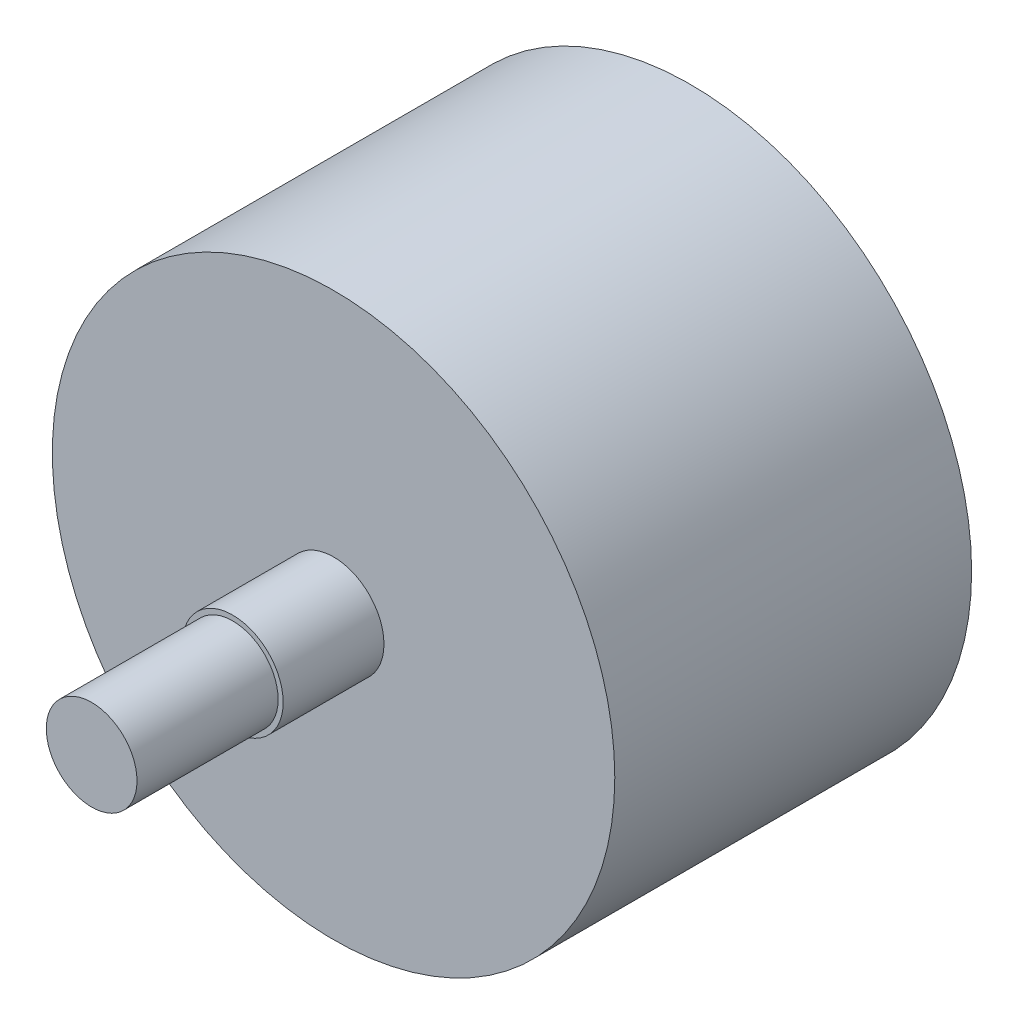
ISO-10303-21;
HEADER;
FILE_DESCRIPTION(('STEP AP214'),'2;1');
FILE_NAME('part.step','',(''),(''),'','','');
FILE_SCHEMA(('AUTOMOTIVE_DESIGN { 1 0 10303 214 1 1 1 1 }'));
ENDSEC;
DATA;
#1=APPLICATION_CONTEXT('core data for automotive mechanical design processes');
#2=APPLICATION_PROTOCOL_DEFINITION('international standard','automotive_design',2000,#1);
#3=PRODUCT_CONTEXT('',#1,'mechanical');
#4=PRODUCT('Part','Part','',(#3));
#5=PRODUCT_RELATED_PRODUCT_CATEGORY('part','',(#4));
#6=PRODUCT_DEFINITION_FORMATION('','',#4);
#7=PRODUCT_DEFINITION_CONTEXT('part definition',#1,'design');
#8=PRODUCT_DEFINITION('design','',#6,#7);
#9=PRODUCT_DEFINITION_SHAPE('','',#8);
#10=(LENGTH_UNIT() NAMED_UNIT(*) SI_UNIT(.MILLI.,.METRE.));
#11=(NAMED_UNIT(*) PLANE_ANGLE_UNIT() SI_UNIT($,.RADIAN.));
#12=(NAMED_UNIT(*) SI_UNIT($,.STERADIAN.) SOLID_ANGLE_UNIT());
#13=UNCERTAINTY_MEASURE_WITH_UNIT(LENGTH_MEASURE(1.E-05),#10,'distance_accuracy_value','');
#14=(GEOMETRIC_REPRESENTATION_CONTEXT(3) GLOBAL_UNCERTAINTY_ASSIGNED_CONTEXT((#13)) GLOBAL_UNIT_ASSIGNED_CONTEXT((#10,
#11,#12)) REPRESENTATION_CONTEXT('',''));
#15=CARTESIAN_POINT('',(0.,0.,0.));
#16=DIRECTION('',(0.,0.,1.));
#17=DIRECTION('',(1.,0.,0.));
#18=AXIS2_PLACEMENT_3D('',#15,#16,#17);
#19=CARTESIAN_POINT('',(0.,0.,0.));
#20=DIRECTION('',(0.,0.,1.));
#21=DIRECTION('',(1.,0.,0.));
#22=AXIS2_PLACEMENT_3D('',#19,#20,#21);
#23=PLANE('',#22);
#24=CARTESIAN_POINT('',(0.,0.,0.));
#25=DIRECTION('',(0.,0.,-1.));
#26=DIRECTION('',(-1.,0.,0.));
#27=AXIS2_PLACEMENT_3D('',#24,#25,#26);
#28=CIRCLE('',#27,1.2);
#29=CARTESIAN_POINT('',(-1.2,0.,0.));
#30=VERTEX_POINT('',#29);
#31=EDGE_CURVE('E24',#30,#30,#28,.T.);
#32=ORIENTED_EDGE('',*,*,#31,.F.);
#33=EDGE_LOOP('',(#32));
#34=FACE_BOUND('',#33,.T.);
#35=CARTESIAN_POINT('',(5.65685424949238,-5.65685424949238,0.));
#36=DIRECTION('',(0.,0.,-1.));
#37=DIRECTION('',(-1.,0.,0.));
#38=AXIS2_PLACEMENT_3D('',#35,#36,#37);
#39=CIRCLE('',#38,1.5);
#40=CARTESIAN_POINT('',(4.15685424949238,-5.65685424949238,0.));
#41=VERTEX_POINT('',#40);
#42=EDGE_CURVE('E49',#41,#41,#39,.T.);
#43=ORIENTED_EDGE('',*,*,#42,.F.);
#44=EDGE_LOOP('',(#43));
#45=FACE_BOUND('',#44,.T.);
#46=CARTESIAN_POINT('',(-6.7175144212722,-6.7175144212722,0.));
#47=DIRECTION('',(0.,0.,-1.));
#48=DIRECTION('',(-1.,0.,0.));
#49=AXIS2_PLACEMENT_3D('',#46,#47,#48);
#50=CIRCLE('',#49,1.5);
#51=CARTESIAN_POINT('',(-8.2175144212722,-6.7175144212722,0.));
#52=VERTEX_POINT('',#51);
#53=EDGE_CURVE('E48',#52,#52,#50,.T.);
#54=ORIENTED_EDGE('',*,*,#53,.F.);
#55=EDGE_LOOP('',(#54));
#56=FACE_BOUND('',#55,.T.);
#57=CARTESIAN_POINT('',(0.,0.,0.));
#58=DIRECTION('',(0.,0.,1.));
#59=DIRECTION('',(1.,0.,0.));
#60=AXIS2_PLACEMENT_3D('',#57,#58,#59);
#61=CIRCLE('',#60,13.95);
#62=CARTESIAN_POINT('',(13.95,0.,0.));
#63=VERTEX_POINT('',#62);
#64=EDGE_CURVE('E19',#63,#63,#61,.T.);
#65=ORIENTED_EDGE('',*,*,#64,.F.);
#66=EDGE_LOOP('',(#65));
#67=FACE_BOUND('',#66,.T.);
#68=CARTESIAN_POINT('',(6.7175144212722,6.7175144212722,0.));
#69=DIRECTION('',(0.,0.,1.));
#70=DIRECTION('',(-1.,0.,0.));
#71=AXIS2_PLACEMENT_3D('',#68,#69,#70);
#72=CIRCLE('',#71,1.5);
#73=CARTESIAN_POINT('',(5.2175144212722,6.7175144212722,0.));
#74=VERTEX_POINT('',#73);
#75=EDGE_CURVE('E57',#74,#74,#72,.T.);
#76=ORIENTED_EDGE('',*,*,#75,.T.);
#77=EDGE_LOOP('',(#76));
#78=FACE_BOUND('',#77,.T.);
#79=CARTESIAN_POINT('',(-5.65685424949238,5.65685424949238,0.));
#80=DIRECTION('',(0.,0.,1.));
#81=DIRECTION('',(-1.,0.,0.));
#82=AXIS2_PLACEMENT_3D('',#79,#80,#81);
#83=CIRCLE('',#82,1.5);
#84=CARTESIAN_POINT('',(-7.15685424949238,5.65685424949238,0.));
#85=VERTEX_POINT('',#84);
#86=EDGE_CURVE('E42',#85,#85,#83,.T.);
#87=ORIENTED_EDGE('',*,*,#86,.T.);
#88=EDGE_LOOP('',(#87));
#89=FACE_BOUND('',#88,.T.);
#90=ADVANCED_FACE('F15',(#34,#45,#56,#67,#78,#89),#23,.F.);
#91=CARTESIAN_POINT('',(0.,0.,17.7));
#92=DIRECTION('',(0.,0.,-1.));
#93=DIRECTION('',(-1.,0.,0.));
#94=AXIS2_PLACEMENT_3D('',#91,#92,#93);
#95=CYLINDRICAL_SURFACE('',#94,13.95);
#96=CARTESIAN_POINT('',(0.,0.,17.7));
#97=DIRECTION('',(0.,0.,1.));
#98=DIRECTION('',(1.,0.,0.));
#99=AXIS2_PLACEMENT_3D('',#96,#97,#98);
#100=CIRCLE('',#99,13.95);
#101=CARTESIAN_POINT('',(13.95,0.,17.7));
#102=VERTEX_POINT('',#101);
#103=EDGE_CURVE('E81',#102,#102,#100,.T.);
#104=ORIENTED_EDGE('',*,*,#103,.F.);
#105=EDGE_LOOP('',(#104));
#106=FACE_BOUND('',#105,.T.);
#107=ORIENTED_EDGE('',*,*,#64,.T.);
#108=EDGE_LOOP('',(#107));
#109=FACE_BOUND('',#108,.T.);
#110=ADVANCED_FACE('F17',(#106,#109),#95,.T.);
#111=CARTESIAN_POINT('',(0.,0.,17.7));
#112=DIRECTION('',(0.,0.,1.));
#113=DIRECTION('',(1.,0.,0.));
#114=AXIS2_PLACEMENT_3D('',#111,#112,#113);
#115=PLANE('',#114);
#116=CARTESIAN_POINT('',(0.,0.,17.7));
#117=DIRECTION('',(0.,0.,1.));
#118=DIRECTION('',(1.,0.,0.));
#119=AXIS2_PLACEMENT_3D('',#116,#117,#118);
#120=CIRCLE('',#119,2.5);
#121=CARTESIAN_POINT('',(2.5,0.,17.7));
#122=VERTEX_POINT('',#121);
#123=EDGE_CURVE('E34',#122,#122,#120,.T.);
#124=ORIENTED_EDGE('',*,*,#123,.F.);
#125=EDGE_LOOP('',(#124));
#126=FACE_BOUND('',#125,.T.);
#127=ORIENTED_EDGE('',*,*,#103,.T.);
#128=EDGE_LOOP('',(#127));
#129=FACE_BOUND('',#128,.T.);
#130=ADVANCED_FACE('F136',(#126,#129),#115,.T.);
#131=CARTESIAN_POINT('',(0.,0.,22.7));
#132=DIRECTION('',(0.,0.,-1.));
#133=DIRECTION('',(-1.,0.,0.));
#134=AXIS2_PLACEMENT_3D('',#131,#132,#133);
#135=CYLINDRICAL_SURFACE('',#134,2.5);
#136=CARTESIAN_POINT('',(0.,0.,22.7));
#137=DIRECTION('',(0.,0.,1.));
#138=DIRECTION('',(1.,0.,0.));
#139=AXIS2_PLACEMENT_3D('',#136,#137,#138);
#140=CIRCLE('',#139,2.5);
#141=CARTESIAN_POINT('',(2.5,0.,22.7));
#142=VERTEX_POINT('',#141);
#143=EDGE_CURVE('E72',#142,#142,#140,.T.);
#144=ORIENTED_EDGE('',*,*,#143,.F.);
#145=EDGE_LOOP('',(#144));
#146=FACE_BOUND('',#145,.T.);
#147=ORIENTED_EDGE('',*,*,#123,.T.);
#148=EDGE_LOOP('',(#147));
#149=FACE_BOUND('',#148,.T.);
#150=ADVANCED_FACE('F132',(#146,#149),#135,.T.);
#151=CARTESIAN_POINT('',(0.,0.,22.7));
#152=DIRECTION('',(0.,0.,1.));
#153=DIRECTION('',(1.,0.,0.));
#154=AXIS2_PLACEMENT_3D('',#151,#152,#153);
#155=PLANE('',#154);
#156=CARTESIAN_POINT('',(0.,0.,22.7));
#157=DIRECTION('',(0.,0.,1.));
#158=DIRECTION('',(1.,0.,0.));
#159=AXIS2_PLACEMENT_3D('',#156,#157,#158);
#160=CIRCLE('',#159,2.25);
#161=CARTESIAN_POINT('',(2.25,0.,22.7));
#162=VERTEX_POINT('',#161);
#163=EDGE_CURVE('E10',#162,#162,#160,.T.);
#164=ORIENTED_EDGE('',*,*,#163,.F.);
#165=EDGE_LOOP('',(#164));
#166=FACE_BOUND('',#165,.T.);
#167=ORIENTED_EDGE('',*,*,#143,.T.);
#168=EDGE_LOOP('',(#167));
#169=FACE_BOUND('',#168,.T.);
#170=ADVANCED_FACE('F128',(#166,#169),#155,.T.);
#171=CARTESIAN_POINT('',(-6.7175144212722,-6.7175144212722,3.));
#172=DIRECTION('',(0.,0.,-1.));
#173=DIRECTION('',(-1.,0.,0.));
#174=AXIS2_PLACEMENT_3D('',#171,#172,#173);
#175=CYLINDRICAL_SURFACE('',#174,1.5);
#176=CARTESIAN_POINT('',(-6.7175144212722,-6.7175144212722,3.));
#177=DIRECTION('',(0.,0.,-1.));
#178=DIRECTION('',(-1.,0.,0.));
#179=AXIS2_PLACEMENT_3D('',#176,#177,#178);
#180=CIRCLE('',#179,1.5);
#181=CARTESIAN_POINT('',(-8.2175144212722,-6.7175144212722,3.));
#182=VERTEX_POINT('',#181);
#183=EDGE_CURVE('E68',#182,#182,#180,.T.);
#184=ORIENTED_EDGE('',*,*,#183,.F.);
#185=EDGE_LOOP('',(#184));
#186=FACE_BOUND('',#185,.T.);
#187=ORIENTED_EDGE('',*,*,#53,.T.);
#188=EDGE_LOOP('',(#187));
#189=FACE_BOUND('',#188,.T.);
#190=ADVANCED_FACE('F124',(#186,#189),#175,.F.);
#191=CARTESIAN_POINT('',(0.,0.,3.));
#192=DIRECTION('',(0.,0.,-1.));
#193=DIRECTION('',(1.,0.,0.));
#194=AXIS2_PLACEMENT_3D('',#191,#192,#193);
#195=PLANE('',#194);
#196=ORIENTED_EDGE('',*,*,#183,.T.);
#197=EDGE_LOOP('',(#196));
#198=FACE_BOUND('',#197,.T.);
#199=ADVANCED_FACE('F120',(#198),#195,.T.);
#200=CARTESIAN_POINT('',(5.65685424949238,-5.65685424949238,3.));
#201=DIRECTION('',(0.,0.,-1.));
#202=DIRECTION('',(-1.,0.,0.));
#203=AXIS2_PLACEMENT_3D('',#200,#201,#202);
#204=CYLINDRICAL_SURFACE('',#203,1.5);
#205=CARTESIAN_POINT('',(5.65685424949238,-5.65685424949238,3.));
#206=DIRECTION('',(0.,0.,-1.));
#207=DIRECTION('',(-1.,0.,0.));
#208=AXIS2_PLACEMENT_3D('',#205,#206,#207);
#209=CIRCLE('',#208,1.5);
#210=CARTESIAN_POINT('',(4.15685424949238,-5.65685424949238,3.));
#211=VERTEX_POINT('',#210);
#212=EDGE_CURVE('E44',#211,#211,#209,.T.);
#213=ORIENTED_EDGE('',*,*,#212,.F.);
#214=EDGE_LOOP('',(#213));
#215=FACE_BOUND('',#214,.T.);
#216=ORIENTED_EDGE('',*,*,#42,.T.);
#217=EDGE_LOOP('',(#216));
#218=FACE_BOUND('',#217,.T.);
#219=ADVANCED_FACE('F123',(#215,#218),#204,.F.);
#220=CARTESIAN_POINT('',(0.,0.,3.));
#221=DIRECTION('',(0.,0.,-1.));
#222=DIRECTION('',(1.,0.,0.));
#223=AXIS2_PLACEMENT_3D('',#220,#221,#222);
#224=PLANE('',#223);
#225=ORIENTED_EDGE('',*,*,#212,.T.);
#226=EDGE_LOOP('',(#225));
#227=FACE_BOUND('',#226,.T.);
#228=ADVANCED_FACE('F209',(#227),#224,.T.);
#229=CARTESIAN_POINT('',(6.7175144212722,6.7175144212722,3.));
#230=DIRECTION('',(0.,0.,-1.));
#231=DIRECTION('',(-1.,0.,0.));
#232=AXIS2_PLACEMENT_3D('',#229,#230,#231);
#233=CYLINDRICAL_SURFACE('',#232,1.5);
#234=CARTESIAN_POINT('',(6.7175144212722,6.7175144212722,3.));
#235=DIRECTION('',(0.,0.,1.));
#236=DIRECTION('',(-1.,0.,0.));
#237=AXIS2_PLACEMENT_3D('',#234,#235,#236);
#238=CIRCLE('',#237,1.5);
#239=CARTESIAN_POINT('',(5.2175144212722,6.7175144212722,3.));
#240=VERTEX_POINT('',#239);
#241=EDGE_CURVE('E53',#240,#240,#238,.T.);
#242=ORIENTED_EDGE('',*,*,#241,.T.);
#243=EDGE_LOOP('',(#242));
#244=FACE_BOUND('',#243,.T.);
#245=ORIENTED_EDGE('',*,*,#75,.F.);
#246=EDGE_LOOP('',(#245));
#247=FACE_BOUND('',#246,.T.);
#248=ADVANCED_FACE('F115',(#244,#247),#233,.F.);
#249=CARTESIAN_POINT('',(0.,0.,3.));
#250=DIRECTION('',(0.,0.,-1.));
#251=DIRECTION('',(1.,0.,0.));
#252=AXIS2_PLACEMENT_3D('',#249,#250,#251);
#253=PLANE('',#252);
#254=ORIENTED_EDGE('',*,*,#241,.F.);
#255=EDGE_LOOP('',(#254));
#256=FACE_BOUND('',#255,.T.);
#257=ADVANCED_FACE('F104',(#256),#253,.T.);
#258=CARTESIAN_POINT('',(-5.65685424949238,5.65685424949238,3.));
#259=DIRECTION('',(0.,0.,-1.));
#260=DIRECTION('',(-1.,0.,0.));
#261=AXIS2_PLACEMENT_3D('',#258,#259,#260);
#262=CYLINDRICAL_SURFACE('',#261,1.5);
#263=CARTESIAN_POINT('',(-5.65685424949238,5.65685424949238,3.));
#264=DIRECTION('',(0.,0.,1.));
#265=DIRECTION('',(-1.,0.,0.));
#266=AXIS2_PLACEMENT_3D('',#263,#264,#265);
#267=CIRCLE('',#266,1.5);
#268=CARTESIAN_POINT('',(-7.15685424949238,5.65685424949238,3.));
#269=VERTEX_POINT('',#268);
#270=EDGE_CURVE('E61',#269,#269,#267,.T.);
#271=ORIENTED_EDGE('',*,*,#270,.T.);
#272=EDGE_LOOP('',(#271));
#273=FACE_BOUND('',#272,.T.);
#274=ORIENTED_EDGE('',*,*,#86,.F.);
#275=EDGE_LOOP('',(#274));
#276=FACE_BOUND('',#275,.T.);
#277=ADVANCED_FACE('F101',(#273,#276),#262,.F.);
#278=CARTESIAN_POINT('',(0.,0.,3.));
#279=DIRECTION('',(0.,0.,-1.));
#280=DIRECTION('',(1.,0.,0.));
#281=AXIS2_PLACEMENT_3D('',#278,#279,#280);
#282=PLANE('',#281);
#283=ORIENTED_EDGE('',*,*,#270,.F.);
#284=EDGE_LOOP('',(#283));
#285=FACE_BOUND('',#284,.T.);
#286=ADVANCED_FACE('F103',(#285),#282,.T.);
#287=CARTESIAN_POINT('',(0.,0.,-2.5));
#288=DIRECTION('',(0.,0.,1.));
#289=DIRECTION('',(1.,0.,0.));
#290=AXIS2_PLACEMENT_3D('',#287,#288,#289);
#291=CYLINDRICAL_SURFACE('',#290,1.2);
#292=CARTESIAN_POINT('',(0.,0.,-2.5));
#293=DIRECTION('',(0.,0.,-1.));
#294=DIRECTION('',(-1.,0.,0.));
#295=AXIS2_PLACEMENT_3D('',#292,#293,#294);
#296=CIRCLE('',#295,1.2);
#297=CARTESIAN_POINT('',(-1.2,0.,-2.5));
#298=VERTEX_POINT('',#297);
#299=EDGE_CURVE('E39',#298,#298,#296,.T.);
#300=ORIENTED_EDGE('',*,*,#299,.F.);
#301=EDGE_LOOP('',(#300));
#302=FACE_BOUND('',#301,.T.);
#303=ORIENTED_EDGE('',*,*,#31,.T.);
#304=EDGE_LOOP('',(#303));
#305=FACE_BOUND('',#304,.T.);
#306=ADVANCED_FACE('F112',(#302,#305),#291,.T.);
#307=CARTESIAN_POINT('',(0.,0.,-2.5));
#308=DIRECTION('',(0.,0.,-1.));
#309=DIRECTION('',(1.,0.,0.));
#310=AXIS2_PLACEMENT_3D('',#307,#308,#309);
#311=PLANE('',#310);
#312=ORIENTED_EDGE('',*,*,#299,.T.);
#313=EDGE_LOOP('',(#312));
#314=FACE_BOUND('',#313,.T.);
#315=ADVANCED_FACE('F259',(#314),#311,.T.);
#316=CARTESIAN_POINT('',(0.,0.,29.7));
#317=DIRECTION('',(0.,0.,-1.));
#318=DIRECTION('',(-1.,0.,0.));
#319=AXIS2_PLACEMENT_3D('',#316,#317,#318);
#320=CYLINDRICAL_SURFACE('',#319,2.25);
#321=CARTESIAN_POINT('',(0.,0.,29.7));
#322=DIRECTION('',(0.,0.,1.));
#323=DIRECTION('',(1.,0.,0.));
#324=AXIS2_PLACEMENT_3D('',#321,#322,#323);
#325=CIRCLE('',#324,2.25);
#326=CARTESIAN_POINT('',(2.25,0.,29.7));
#327=VERTEX_POINT('',#326);
#328=EDGE_CURVE('E38',#327,#327,#325,.T.);
#329=ORIENTED_EDGE('',*,*,#328,.F.);
#330=EDGE_LOOP('',(#329));
#331=FACE_BOUND('',#330,.T.);
#332=ORIENTED_EDGE('',*,*,#163,.T.);
#333=EDGE_LOOP('',(#332));
#334=FACE_BOUND('',#333,.T.);
#335=ADVANCED_FACE('F270',(#331,#334),#320,.T.);
#336=CARTESIAN_POINT('',(0.,0.,29.7));
#337=DIRECTION('',(0.,0.,1.));
#338=DIRECTION('',(1.,0.,0.));
#339=AXIS2_PLACEMENT_3D('',#336,#337,#338);
#340=PLANE('',#339);
#341=ORIENTED_EDGE('',*,*,#328,.T.);
#342=EDGE_LOOP('',(#341));
#343=FACE_BOUND('',#342,.T.);
#344=ADVANCED_FACE('F281',(#343),#340,.T.);
#345=CLOSED_SHELL('',(#90,#110,#130,#150,#170,#190,#199,#219,#228,#248,#257,#277,#286,#306,#315,
#335,#344));
#346=MANIFOLD_SOLID_BREP('B1',#345);
#347=ADVANCED_BREP_SHAPE_REPRESENTATION('',(#18,#346),#14);
#348=SHAPE_DEFINITION_REPRESENTATION(#9,#347);
ENDSEC;
END-ISO-10303-21;
